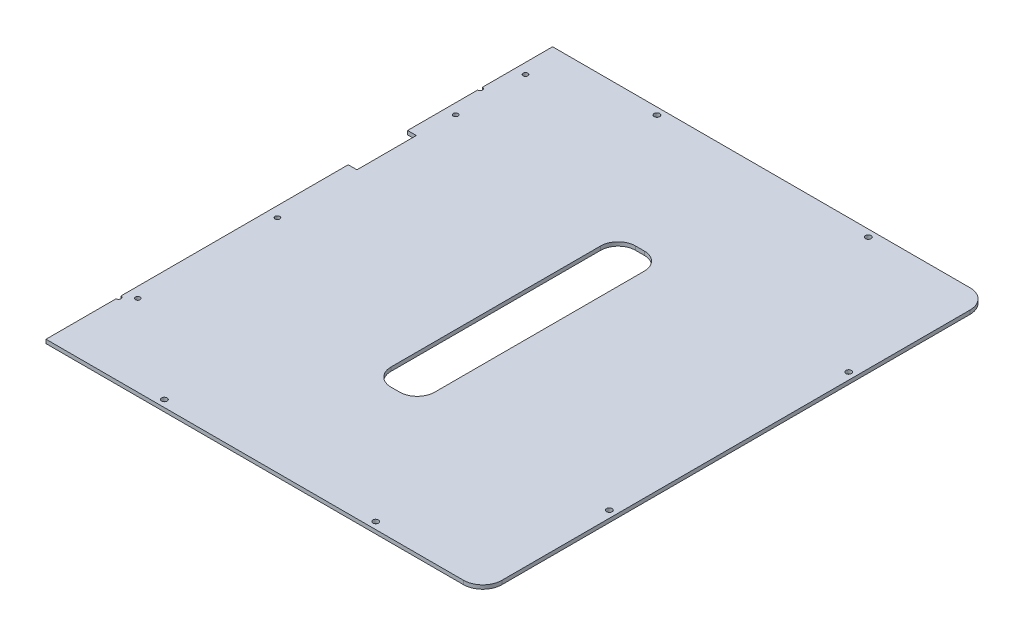
ISO-10303-21;
HEADER;
FILE_DESCRIPTION(('STEP AP214'),'2;1');
FILE_NAME('part.step','',(''),(''),'','','');
FILE_SCHEMA(('AUTOMOTIVE_DESIGN { 1 0 10303 214 1 1 1 1 }'));
ENDSEC;
DATA;
#1=APPLICATION_CONTEXT('core data for automotive mechanical design processes');
#2=APPLICATION_PROTOCOL_DEFINITION('international standard','automotive_design',2000,#1);
#3=PRODUCT_CONTEXT('',#1,'mechanical');
#4=PRODUCT('Part','Part','',(#3));
#5=PRODUCT_RELATED_PRODUCT_CATEGORY('part','',(#4));
#6=PRODUCT_DEFINITION_FORMATION('','',#4);
#7=PRODUCT_DEFINITION_CONTEXT('part definition',#1,'design');
#8=PRODUCT_DEFINITION('design','',#6,#7);
#9=PRODUCT_DEFINITION_SHAPE('','',#8);
#10=(LENGTH_UNIT() NAMED_UNIT(*) SI_UNIT(.MILLI.,.METRE.));
#11=(NAMED_UNIT(*) PLANE_ANGLE_UNIT() SI_UNIT($,.RADIAN.));
#12=(NAMED_UNIT(*) SI_UNIT($,.STERADIAN.) SOLID_ANGLE_UNIT());
#13=UNCERTAINTY_MEASURE_WITH_UNIT(LENGTH_MEASURE(1.E-05),#10,'distance_accuracy_value','');
#14=(GEOMETRIC_REPRESENTATION_CONTEXT(3) GLOBAL_UNCERTAINTY_ASSIGNED_CONTEXT((#13)) GLOBAL_UNIT_ASSIGNED_CONTEXT((#10,
#11,#12)) REPRESENTATION_CONTEXT('',''));
#15=CARTESIAN_POINT('',(0.,0.,0.));
#16=DIRECTION('',(0.,0.,1.));
#17=DIRECTION('',(1.,0.,0.));
#18=AXIS2_PLACEMENT_3D('',#15,#16,#17);
#19=CARTESIAN_POINT('',(-239.,2.2,134.));
#20=DIRECTION('',(0.,1.,0.));
#21=DIRECTION('',(0.,0.,1.));
#22=AXIS2_PLACEMENT_3D('',#19,#20,#21);
#23=PLANE('',#22);
#24=DIRECTION('',(0.,0.,-1.));
#25=VECTOR('',#24,1.);
#26=CARTESIAN_POINT('',(1.66533453693773E-13,2.2,-145.));
#27=LINE('',#26,#25);
#28=CARTESIAN_POINT('',(1.66533453693773E-13,2.2,145.));
#29=VERTEX_POINT('',#28);
#30=CARTESIAN_POINT('',(1.66533453693774E-13,2.2,104.9));
#31=VERTEX_POINT('',#30);
#32=EDGE_CURVE('E56',#29,#31,#27,.T.);
#33=ORIENTED_EDGE('',*,*,#32,.F.);
#34=DIRECTION('',(1.,0.,0.));
#35=VECTOR('',#34,1.);
#36=CARTESIAN_POINT('',(-239.,2.2,145.));
#37=LINE('',#36,#35);
#38=CARTESIAN_POINT('',(239.,2.2,145.));
#39=VERTEX_POINT('',#38);
#40=EDGE_CURVE('E239',#29,#39,#37,.T.);
#41=ORIENTED_EDGE('',*,*,#40,.T.);
#42=CARTESIAN_POINT('',(239.,2.2,134.));
#43=DIRECTION('',(0.,1.,0.));
#44=DIRECTION('',(0.,0.,-1.));
#45=AXIS2_PLACEMENT_3D('',#42,#43,#44);
#46=CIRCLE('',#45,11.);
#47=CARTESIAN_POINT('',(250.,2.2,134.));
#48=VERTEX_POINT('',#47);
#49=EDGE_CURVE('E441',#39,#48,#46,.T.);
#50=ORIENTED_EDGE('',*,*,#49,.T.);
#51=DIRECTION('',(0.,0.,-1.));
#52=VECTOR('',#51,1.);
#53=CARTESIAN_POINT('',(250.,2.2,-134.));
#54=LINE('',#53,#52);
#55=CARTESIAN_POINT('',(250.,2.2,-134.));
#56=VERTEX_POINT('',#55);
#57=EDGE_CURVE('E221',#48,#56,#54,.T.);
#58=ORIENTED_EDGE('',*,*,#57,.T.);
#59=CARTESIAN_POINT('',(239.,2.2,-134.));
#60=DIRECTION('',(0.,1.,0.));
#61=DIRECTION('',(0.,0.,1.));
#62=AXIS2_PLACEMENT_3D('',#59,#60,#61);
#63=CIRCLE('',#62,11.);
#64=CARTESIAN_POINT('',(239.,2.2,-145.));
#65=VERTEX_POINT('',#64);
#66=EDGE_CURVE('E212',#56,#65,#63,.T.);
#67=ORIENTED_EDGE('',*,*,#66,.T.);
#68=DIRECTION('',(-1.,0.,0.));
#69=VECTOR('',#68,1.);
#70=CARTESIAN_POINT('',(-239.,2.2,-145.));
#71=LINE('',#70,#69);
#72=CARTESIAN_POINT('',(1.66533453693773E-13,2.2,-145.));
#73=VERTEX_POINT('',#72);
#74=EDGE_CURVE('E204',#65,#73,#71,.T.);
#75=ORIENTED_EDGE('',*,*,#74,.T.);
#76=CARTESIAN_POINT('',(1.66533453693773E-13,2.2,-104.9));
#77=VERTEX_POINT('',#76);
#78=EDGE_CURVE('E187',#77,#73,#27,.T.);
#79=ORIENTED_EDGE('',*,*,#78,.F.);
#80=CARTESIAN_POINT('',(0.,2.2,-103.5));
#81=DIRECTION('',(0.,1.,0.));
#82=DIRECTION('',(0.,0.,1.));
#83=AXIS2_PLACEMENT_3D('',#80,#81,#82);
#84=CIRCLE('',#83,1.40000000000001);
#85=CARTESIAN_POINT('',(1.66533453693773E-13,2.2,-102.1));
#86=VERTEX_POINT('',#85);
#87=EDGE_CURVE('E402',#86,#77,#84,.T.);
#88=ORIENTED_EDGE('',*,*,#87,.F.);
#89=CARTESIAN_POINT('',(1.66533453693773E-13,2.2,-62.0000000000001));
#90=VERTEX_POINT('',#89);
#91=EDGE_CURVE('E197',#90,#86,#27,.T.);
#92=ORIENTED_EDGE('',*,*,#91,.F.);
#93=DIRECTION('',(-1.,0.,0.));
#94=VECTOR('',#93,1.);
#95=CARTESIAN_POINT('',(-5.,2.2,-62.0000000000001));
#96=LINE('',#95,#94);
#97=CARTESIAN_POINT('',(5.,2.2,-62.0000000000001));
#98=VERTEX_POINT('',#97);
#99=EDGE_CURVE('E781',#98,#90,#96,.T.);
#100=ORIENTED_EDGE('',*,*,#99,.F.);
#101=DIRECTION('',(0.,0.,-1.));
#102=VECTOR('',#101,1.);
#103=CARTESIAN_POINT('',(5.,2.2,-28.));
#104=LINE('',#103,#102);
#105=CARTESIAN_POINT('',(5.,2.2,-28.));
#106=VERTEX_POINT('',#105);
#107=EDGE_CURVE('E285',#106,#98,#104,.T.);
#108=ORIENTED_EDGE('',*,*,#107,.F.);
#109=DIRECTION('',(1.,0.,0.));
#110=VECTOR('',#109,1.);
#111=CARTESIAN_POINT('',(-5.,2.2,-28.));
#112=LINE('',#111,#110);
#113=CARTESIAN_POINT('',(1.66533453693773E-13,2.2,-28.));
#114=VERTEX_POINT('',#113);
#115=EDGE_CURVE('E280',#114,#106,#112,.T.);
#116=ORIENTED_EDGE('',*,*,#115,.F.);
#117=CARTESIAN_POINT('',(1.66533453693773E-13,2.2,102.1));
#118=VERTEX_POINT('',#117);
#119=EDGE_CURVE('E791',#118,#114,#27,.T.);
#120=ORIENTED_EDGE('',*,*,#119,.F.);
#121=CARTESIAN_POINT('',(0.,2.2,103.5));
#122=DIRECTION('',(0.,1.,0.));
#123=DIRECTION('',(0.,0.,1.));
#124=AXIS2_PLACEMENT_3D('',#121,#122,#123);
#125=CIRCLE('',#124,1.4);
#126=EDGE_CURVE('E409',#31,#118,#125,.T.);
#127=ORIENTED_EDGE('',*,*,#126,.F.);
#128=EDGE_LOOP('',(#33,#41,#50,#58,#67,#75,#79,#88,#92,#100,#108,#116,#120,#127));
#129=FACE_BOUND('',#128,.T.);
#130=CARTESIAN_POINT('',(6.00000000000004,2.2,98.5));
#131=DIRECTION('',(0.,1.,0.));
#132=DIRECTION('',(0.,0.,1.));
#133=AXIS2_PLACEMENT_3D('',#130,#131,#132);
#134=CIRCLE('',#133,1.35);
#135=CARTESIAN_POINT('',(6.00000000000004,2.2,99.85));
#136=VERTEX_POINT('',#135);
#137=EDGE_CURVE('E773',#136,#136,#134,.T.);
#138=ORIENTED_EDGE('',*,*,#137,.F.);
#139=EDGE_LOOP('',(#138));
#140=FACE_BOUND('',#139,.T.);
#141=CARTESIAN_POINT('',(6.00000000000004,2.2,18.5));
#142=DIRECTION('',(0.,1.,0.));
#143=DIRECTION('',(0.,0.,1.));
#144=AXIS2_PLACEMENT_3D('',#141,#142,#143);
#145=CIRCLE('',#144,1.35);
#146=CARTESIAN_POINT('',(6.00000000000004,2.2,19.85));
#147=VERTEX_POINT('',#146);
#148=EDGE_CURVE('E256',#147,#147,#145,.T.);
#149=ORIENTED_EDGE('',*,*,#148,.F.);
#150=EDGE_LOOP('',(#149));
#151=FACE_BOUND('',#150,.T.);
#152=CARTESIAN_POINT('',(5.99999999999996,2.2,-83.5000000000001));
#153=DIRECTION('',(0.,1.,0.));
#154=DIRECTION('',(0.,0.,1.));
#155=AXIS2_PLACEMENT_3D('',#152,#153,#154);
#156=CIRCLE('',#155,1.35);
#157=CARTESIAN_POINT('',(5.99999999999996,2.2,-82.1500000000001));
#158=VERTEX_POINT('',#157);
#159=EDGE_CURVE('E765',#158,#158,#156,.T.);
#160=ORIENTED_EDGE('',*,*,#159,.F.);
#161=EDGE_LOOP('',(#160));
#162=FACE_BOUND('',#161,.T.);
#163=CARTESIAN_POINT('',(5.99999999999996,2.2,-123.5));
#164=DIRECTION('',(0.,1.,0.));
#165=DIRECTION('',(0.,0.,1.));
#166=AXIS2_PLACEMENT_3D('',#163,#164,#165);
#167=CIRCLE('',#166,1.35);
#168=CARTESIAN_POINT('',(5.99999999999996,2.2,-122.15));
#169=VERTEX_POINT('',#168);
#170=EDGE_CURVE('E769',#169,#169,#167,.T.);
#171=ORIENTED_EDGE('',*,*,#170,.F.);
#172=EDGE_LOOP('',(#171));
#173=FACE_BOUND('',#172,.T.);
#174=CARTESIAN_POINT('',(63.75,2.2,141.));
#175=DIRECTION('',(0.,1.,0.));
#176=DIRECTION('',(0.,0.,-1.));
#177=AXIS2_PLACEMENT_3D('',#174,#175,#176);
#178=CIRCLE('',#177,1.6);
#179=CARTESIAN_POINT('',(63.75,2.2,139.4));
#180=VERTEX_POINT('',#179);
#181=EDGE_CURVE('E295',#180,#180,#178,.T.);
#182=ORIENTED_EDGE('',*,*,#181,.F.);
#183=EDGE_LOOP('',(#182));
#184=FACE_BOUND('',#183,.T.);
#185=CARTESIAN_POINT('',(184.75,2.2,141.));
#186=DIRECTION('',(0.,1.,0.));
#187=DIRECTION('',(0.,0.,-1.));
#188=AXIS2_PLACEMENT_3D('',#185,#186,#187);
#189=CIRCLE('',#188,1.59999999999999);
#190=CARTESIAN_POINT('',(184.75,2.2,139.4));
#191=VERTEX_POINT('',#190);
#192=EDGE_CURVE('E311',#191,#191,#189,.T.);
#193=ORIENTED_EDGE('',*,*,#192,.F.);
#194=EDGE_LOOP('',(#193));
#195=FACE_BOUND('',#194,.T.);
#196=DIRECTION('',(-1.,0.,0.));
#197=VECTOR('',#196,1.);
#198=CARTESIAN_POINT('',(122.5,2.2,-70.0000000000001));
#199=LINE('',#198,#197);
#200=CARTESIAN_POINT('',(127.5,2.2,-70.0000000000001));
#201=VERTEX_POINT('',#200);
#202=CARTESIAN_POINT('',(122.5,2.2,-70.));
#203=VERTEX_POINT('',#202);
#204=EDGE_CURVE('E322',#201,#203,#199,.T.);
#205=ORIENTED_EDGE('',*,*,#204,.F.);
#206=CARTESIAN_POINT('',(127.5,2.2,-60.0000000000001));
#207=DIRECTION('',(0.,1.,0.));
#208=DIRECTION('',(0.,0.,1.));
#209=AXIS2_PLACEMENT_3D('',#206,#207,#208);
#210=CIRCLE('',#209,10.);
#211=CARTESIAN_POINT('',(137.5,2.2,-60.0000000000001));
#212=VERTEX_POINT('',#211);
#213=EDGE_CURVE('E319',#212,#201,#210,.T.);
#214=ORIENTED_EDGE('',*,*,#213,.F.);
#215=DIRECTION('',(0.,0.,-1.));
#216=VECTOR('',#215,1.);
#217=CARTESIAN_POINT('',(137.5,2.2,60.));
#218=LINE('',#217,#216);
#219=CARTESIAN_POINT('',(137.5,2.2,60.));
#220=VERTEX_POINT('',#219);
#221=EDGE_CURVE('E342',#220,#212,#218,.T.);
#222=ORIENTED_EDGE('',*,*,#221,.F.);
#223=CARTESIAN_POINT('',(127.5,2.2,60.));
#224=DIRECTION('',(0.,1.,0.));
#225=DIRECTION('',(0.,0.,-1.));
#226=AXIS2_PLACEMENT_3D('',#223,#224,#225);
#227=CIRCLE('',#226,10.);
#228=CARTESIAN_POINT('',(127.5,2.2,70.));
#229=VERTEX_POINT('',#228);
#230=EDGE_CURVE('E338',#229,#220,#227,.T.);
#231=ORIENTED_EDGE('',*,*,#230,.F.);
#232=DIRECTION('',(1.,0.,0.));
#233=VECTOR('',#232,1.);
#234=CARTESIAN_POINT('',(122.5,2.2,70.));
#235=LINE('',#234,#233);
#236=CARTESIAN_POINT('',(122.5,2.2,70.));
#237=VERTEX_POINT('',#236);
#238=EDGE_CURVE('E335',#237,#229,#235,.T.);
#239=ORIENTED_EDGE('',*,*,#238,.F.);
#240=CARTESIAN_POINT('',(122.5,2.2,60.));
#241=DIRECTION('',(0.,1.,0.));
#242=DIRECTION('',(0.,0.,1.));
#243=AXIS2_PLACEMENT_3D('',#240,#241,#242);
#244=CIRCLE('',#243,9.99999999999999);
#245=CARTESIAN_POINT('',(112.5,2.2,60.));
#246=VERTEX_POINT('',#245);
#247=EDGE_CURVE('E332',#246,#237,#244,.T.);
#248=ORIENTED_EDGE('',*,*,#247,.F.);
#249=DIRECTION('',(0.,0.,1.));
#250=VECTOR('',#249,1.);
#251=CARTESIAN_POINT('',(112.5,2.2,60.));
#252=LINE('',#251,#250);
#253=CARTESIAN_POINT('',(112.5,2.2,-60.0000000000001));
#254=VERTEX_POINT('',#253);
#255=EDGE_CURVE('E329',#254,#246,#252,.T.);
#256=ORIENTED_EDGE('',*,*,#255,.F.);
#257=CARTESIAN_POINT('',(122.5,2.2,-60.0000000000001));
#258=DIRECTION('',(0.,1.,0.));
#259=DIRECTION('',(0.,0.,1.));
#260=AXIS2_PLACEMENT_3D('',#257,#258,#259);
#261=CIRCLE('',#260,9.99999999999999);
#262=EDGE_CURVE('E326',#203,#254,#261,.T.);
#263=ORIENTED_EDGE('',*,*,#262,.F.);
#264=EDGE_LOOP('',(#205,#214,#222,#231,#239,#248,#256,#263));
#265=FACE_BOUND('',#264,.T.);
#266=CARTESIAN_POINT('',(246.,2.2,-68.5));
#267=DIRECTION('',(0.,1.,0.));
#268=DIRECTION('',(0.,0.,1.));
#269=AXIS2_PLACEMENT_3D('',#266,#267,#268);
#270=CIRCLE('',#269,1.60000000000002);
#271=CARTESIAN_POINT('',(246.,2.2,-66.9));
#272=VERTEX_POINT('',#271);
#273=EDGE_CURVE('E417',#272,#272,#270,.T.);
#274=ORIENTED_EDGE('',*,*,#273,.F.);
#275=EDGE_LOOP('',(#274));
#276=FACE_BOUND('',#275,.T.);
#277=CARTESIAN_POINT('',(63.75,2.2,-141.));
#278=DIRECTION('',(0.,1.,0.));
#279=DIRECTION('',(0.,0.,1.));
#280=AXIS2_PLACEMENT_3D('',#277,#278,#279);
#281=CIRCLE('',#280,1.6);
#282=CARTESIAN_POINT('',(63.75,2.2,-139.4));
#283=VERTEX_POINT('',#282);
#284=EDGE_CURVE('E229',#283,#283,#281,.T.);
#285=ORIENTED_EDGE('',*,*,#284,.F.);
#286=EDGE_LOOP('',(#285));
#287=FACE_BOUND('',#286,.T.);
#288=CARTESIAN_POINT('',(184.75,2.2,-141.));
#289=DIRECTION('',(0.,1.,0.));
#290=DIRECTION('',(0.,0.,1.));
#291=AXIS2_PLACEMENT_3D('',#288,#289,#290);
#292=CIRCLE('',#291,1.59999999999999);
#293=CARTESIAN_POINT('',(184.75,2.2,-139.4));
#294=VERTEX_POINT('',#293);
#295=EDGE_CURVE('E425',#294,#294,#292,.T.);
#296=ORIENTED_EDGE('',*,*,#295,.F.);
#297=EDGE_LOOP('',(#296));
#298=FACE_BOUND('',#297,.T.);
#299=CARTESIAN_POINT('',(246.,2.2,68.4999999999999));
#300=DIRECTION('',(0.,1.,0.));
#301=DIRECTION('',(0.,0.,-1.));
#302=AXIS2_PLACEMENT_3D('',#299,#300,#301);
#303=CIRCLE('',#302,1.60000000000002);
#304=CARTESIAN_POINT('',(246.,2.2,66.8999999999999));
#305=VERTEX_POINT('',#304);
#306=EDGE_CURVE('E303',#305,#305,#303,.T.);
#307=ORIENTED_EDGE('',*,*,#306,.F.);
#308=EDGE_LOOP('',(#307));
#309=FACE_BOUND('',#308,.T.);
#310=ADVANCED_FACE('F40',(#129,#140,#151,#162,#173,#184,#195,#265,#276,#287,#298,#309),#23,.T.);
#311=CARTESIAN_POINT('',(-239.,0.,134.));
#312=DIRECTION('',(0.,1.,0.));
#313=DIRECTION('',(0.,0.,1.));
#314=AXIS2_PLACEMENT_3D('',#311,#312,#313);
#315=PLANE('',#314);
#316=CARTESIAN_POINT('',(6.00000000000004,0.,98.5));
#317=DIRECTION('',(0.,1.,0.));
#318=DIRECTION('',(0.,0.,1.));
#319=AXIS2_PLACEMENT_3D('',#316,#317,#318);
#320=CIRCLE('',#319,1.35);
#321=CARTESIAN_POINT('',(6.00000000000004,0.,99.85));
#322=VERTEX_POINT('',#321);
#323=EDGE_CURVE('E263',#322,#322,#320,.T.);
#324=ORIENTED_EDGE('',*,*,#323,.T.);
#325=EDGE_LOOP('',(#324));
#326=FACE_BOUND('',#325,.T.);
#327=CARTESIAN_POINT('',(6.00000000000004,0.,18.5));
#328=DIRECTION('',(0.,1.,0.));
#329=DIRECTION('',(0.,0.,1.));
#330=AXIS2_PLACEMENT_3D('',#327,#328,#329);
#331=CIRCLE('',#330,1.35);
#332=CARTESIAN_POINT('',(6.00000000000004,0.,19.85));
#333=VERTEX_POINT('',#332);
#334=EDGE_CURVE('E260',#333,#333,#331,.T.);
#335=ORIENTED_EDGE('',*,*,#334,.T.);
#336=EDGE_LOOP('',(#335));
#337=FACE_BOUND('',#336,.T.);
#338=CARTESIAN_POINT('',(5.99999999999996,0.,-83.5000000000001));
#339=DIRECTION('',(0.,1.,0.));
#340=DIRECTION('',(0.,0.,1.));
#341=AXIS2_PLACEMENT_3D('',#338,#339,#340);
#342=CIRCLE('',#341,1.35);
#343=CARTESIAN_POINT('',(5.99999999999996,0.,-82.1500000000001));
#344=VERTEX_POINT('',#343);
#345=EDGE_CURVE('E255',#344,#344,#342,.T.);
#346=ORIENTED_EDGE('',*,*,#345,.T.);
#347=EDGE_LOOP('',(#346));
#348=FACE_BOUND('',#347,.T.);
#349=CARTESIAN_POINT('',(5.99999999999996,0.,-123.5));
#350=DIRECTION('',(0.,1.,0.));
#351=DIRECTION('',(0.,0.,1.));
#352=AXIS2_PLACEMENT_3D('',#349,#350,#351);
#353=CIRCLE('',#352,1.35);
#354=CARTESIAN_POINT('',(5.99999999999996,0.,-122.15));
#355=VERTEX_POINT('',#354);
#356=EDGE_CURVE('E251',#355,#355,#353,.T.);
#357=ORIENTED_EDGE('',*,*,#356,.T.);
#358=EDGE_LOOP('',(#357));
#359=FACE_BOUND('',#358,.T.);
#360=CARTESIAN_POINT('',(63.75,0.,141.));
#361=DIRECTION('',(0.,1.,0.));
#362=DIRECTION('',(0.,0.,-1.));
#363=AXIS2_PLACEMENT_3D('',#360,#361,#362);
#364=CIRCLE('',#363,1.6);
#365=CARTESIAN_POINT('',(63.75,0.,139.4));
#366=VERTEX_POINT('',#365);
#367=EDGE_CURVE('E294',#366,#366,#364,.T.);
#368=ORIENTED_EDGE('',*,*,#367,.T.);
#369=EDGE_LOOP('',(#368));
#370=FACE_BOUND('',#369,.T.);
#371=CARTESIAN_POINT('',(246.,0.,68.4999999999999));
#372=DIRECTION('',(0.,1.,0.));
#373=DIRECTION('',(0.,0.,-1.));
#374=AXIS2_PLACEMENT_3D('',#371,#372,#373);
#375=CIRCLE('',#374,1.60000000000002);
#376=CARTESIAN_POINT('',(246.,0.,66.8999999999999));
#377=VERTEX_POINT('',#376);
#378=EDGE_CURVE('E299',#377,#377,#375,.T.);
#379=ORIENTED_EDGE('',*,*,#378,.T.);
#380=EDGE_LOOP('',(#379));
#381=FACE_BOUND('',#380,.T.);
#382=CARTESIAN_POINT('',(184.75,0.,141.));
#383=DIRECTION('',(0.,1.,0.));
#384=DIRECTION('',(0.,0.,-1.));
#385=AXIS2_PLACEMENT_3D('',#382,#383,#384);
#386=CIRCLE('',#385,1.59999999999999);
#387=CARTESIAN_POINT('',(184.75,0.,139.4));
#388=VERTEX_POINT('',#387);
#389=EDGE_CURVE('E307',#388,#388,#386,.T.);
#390=ORIENTED_EDGE('',*,*,#389,.T.);
#391=EDGE_LOOP('',(#390));
#392=FACE_BOUND('',#391,.T.);
#393=DIRECTION('',(1.,0.,0.));
#394=VECTOR('',#393,1.);
#395=CARTESIAN_POINT('',(-239.,0.,145.));
#396=LINE('',#395,#394);
#397=CARTESIAN_POINT('',(1.66533453693773E-13,0.,145.));
#398=VERTEX_POINT('',#397);
#399=CARTESIAN_POINT('',(239.,0.,145.));
#400=VERTEX_POINT('',#399);
#401=EDGE_CURVE('E225',#398,#400,#396,.T.);
#402=ORIENTED_EDGE('',*,*,#401,.F.);
#403=DIRECTION('',(0.,0.,1.));
#404=VECTOR('',#403,1.);
#405=CARTESIAN_POINT('',(1.66533453693773E-13,0.,-145.));
#406=LINE('',#405,#404);
#407=CARTESIAN_POINT('',(1.66533453693773E-13,0.,104.9));
#408=VERTEX_POINT('',#407);
#409=EDGE_CURVE('E208',#408,#398,#406,.T.);
#410=ORIENTED_EDGE('',*,*,#409,.F.);
#411=CARTESIAN_POINT('',(0.,0.,103.5));
#412=DIRECTION('',(0.,1.,0.));
#413=DIRECTION('',(0.,0.,1.));
#414=AXIS2_PLACEMENT_3D('',#411,#412,#413);
#415=CIRCLE('',#414,1.4);
#416=CARTESIAN_POINT('',(1.66533453693773E-13,0.,102.1));
#417=VERTEX_POINT('',#416);
#418=EDGE_CURVE('E405',#408,#417,#415,.T.);
#419=ORIENTED_EDGE('',*,*,#418,.T.);
#420=CARTESIAN_POINT('',(1.66533453693773E-13,0.,-28.));
#421=VERTEX_POINT('',#420);
#422=EDGE_CURVE('E466',#421,#417,#406,.T.);
#423=ORIENTED_EDGE('',*,*,#422,.F.);
#424=DIRECTION('',(1.,0.,0.));
#425=VECTOR('',#424,1.);
#426=CARTESIAN_POINT('',(-5.,0.,-28.));
#427=LINE('',#426,#425);
#428=CARTESIAN_POINT('',(5.,0.,-28.));
#429=VERTEX_POINT('',#428);
#430=EDGE_CURVE('E277',#421,#429,#427,.T.);
#431=ORIENTED_EDGE('',*,*,#430,.T.);
#432=DIRECTION('',(0.,0.,-1.));
#433=VECTOR('',#432,1.);
#434=CARTESIAN_POINT('',(5.,0.,-28.));
#435=LINE('',#434,#433);
#436=CARTESIAN_POINT('',(5.,0.,-62.0000000000001));
#437=VERTEX_POINT('',#436);
#438=EDGE_CURVE('E266',#429,#437,#435,.T.);
#439=ORIENTED_EDGE('',*,*,#438,.T.);
#440=DIRECTION('',(-1.,0.,0.));
#441=VECTOR('',#440,1.);
#442=CARTESIAN_POINT('',(-5.,0.,-62.0000000000001));
#443=LINE('',#442,#441);
#444=CARTESIAN_POINT('',(1.66533453693773E-13,0.,-62.0000000000001));
#445=VERTEX_POINT('',#444);
#446=EDGE_CURVE('E271',#437,#445,#443,.T.);
#447=ORIENTED_EDGE('',*,*,#446,.T.);
#448=CARTESIAN_POINT('',(1.66533453693773E-13,0.,-102.1));
#449=VERTEX_POINT('',#448);
#450=EDGE_CURVE('E461',#449,#445,#406,.T.);
#451=ORIENTED_EDGE('',*,*,#450,.F.);
#452=CARTESIAN_POINT('',(0.,0.,-103.5));
#453=DIRECTION('',(0.,1.,0.));
#454=DIRECTION('',(0.,0.,1.));
#455=AXIS2_PLACEMENT_3D('',#452,#453,#454);
#456=CIRCLE('',#455,1.40000000000001);
#457=CARTESIAN_POINT('',(1.66533453693773E-13,0.,-104.9));
#458=VERTEX_POINT('',#457);
#459=EDGE_CURVE('E401',#449,#458,#456,.T.);
#460=ORIENTED_EDGE('',*,*,#459,.T.);
#461=CARTESIAN_POINT('',(1.66533453693773E-13,0.,-145.));
#462=VERTEX_POINT('',#461);
#463=EDGE_CURVE('E64',#462,#458,#406,.T.);
#464=ORIENTED_EDGE('',*,*,#463,.F.);
#465=DIRECTION('',(-1.,0.,0.));
#466=VECTOR('',#465,1.);
#467=CARTESIAN_POINT('',(-239.,0.,-145.));
#468=LINE('',#467,#466);
#469=CARTESIAN_POINT('',(239.,0.,-145.));
#470=VERTEX_POINT('',#469);
#471=EDGE_CURVE('E206',#470,#462,#468,.T.);
#472=ORIENTED_EDGE('',*,*,#471,.F.);
#473=CARTESIAN_POINT('',(239.,0.,-134.));
#474=DIRECTION('',(0.,1.,0.));
#475=DIRECTION('',(0.,0.,1.));
#476=AXIS2_PLACEMENT_3D('',#473,#474,#475);
#477=CIRCLE('',#476,11.);
#478=CARTESIAN_POINT('',(250.,0.,-134.));
#479=VERTEX_POINT('',#478);
#480=EDGE_CURVE('E235',#479,#470,#477,.T.);
#481=ORIENTED_EDGE('',*,*,#480,.F.);
#482=DIRECTION('',(0.,0.,-1.));
#483=VECTOR('',#482,1.);
#484=CARTESIAN_POINT('',(250.,0.,-134.));
#485=LINE('',#484,#483);
#486=CARTESIAN_POINT('',(250.,0.,134.));
#487=VERTEX_POINT('',#486);
#488=EDGE_CURVE('E232',#487,#479,#485,.T.);
#489=ORIENTED_EDGE('',*,*,#488,.F.);
#490=CARTESIAN_POINT('',(239.,0.,134.));
#491=DIRECTION('',(0.,1.,0.));
#492=DIRECTION('',(0.,0.,-1.));
#493=AXIS2_PLACEMENT_3D('',#490,#491,#492);
#494=CIRCLE('',#493,11.);
#495=EDGE_CURVE('E228',#400,#487,#494,.T.);
#496=ORIENTED_EDGE('',*,*,#495,.F.);
#497=EDGE_LOOP('',(#402,#410,#419,#423,#431,#439,#447,#451,#460,#464,#472,#481,#489,#496));
#498=FACE_BOUND('',#497,.T.);
#499=CARTESIAN_POINT('',(246.,0.,-68.5));
#500=DIRECTION('',(0.,1.,0.));
#501=DIRECTION('',(0.,0.,1.));
#502=AXIS2_PLACEMENT_3D('',#499,#500,#501);
#503=CIRCLE('',#502,1.60000000000002);
#504=CARTESIAN_POINT('',(246.,0.,-66.9));
#505=VERTEX_POINT('',#504);
#506=EDGE_CURVE('E413',#505,#505,#503,.T.);
#507=ORIENTED_EDGE('',*,*,#506,.T.);
#508=EDGE_LOOP('',(#507));
#509=FACE_BOUND('',#508,.T.);
#510=CARTESIAN_POINT('',(184.75,0.,-141.));
#511=DIRECTION('',(0.,1.,0.));
#512=DIRECTION('',(0.,0.,1.));
#513=AXIS2_PLACEMENT_3D('',#510,#511,#512);
#514=CIRCLE('',#513,1.59999999999999);
#515=CARTESIAN_POINT('',(184.75,0.,-139.4));
#516=VERTEX_POINT('',#515);
#517=EDGE_CURVE('E421',#516,#516,#514,.T.);
#518=ORIENTED_EDGE('',*,*,#517,.T.);
#519=EDGE_LOOP('',(#518));
#520=FACE_BOUND('',#519,.T.);
#521=CARTESIAN_POINT('',(63.75,0.,-141.));
#522=DIRECTION('',(0.,1.,0.));
#523=DIRECTION('',(0.,0.,1.));
#524=AXIS2_PLACEMENT_3D('',#521,#522,#523);
#525=CIRCLE('',#524,1.6);
#526=CARTESIAN_POINT('',(63.75,0.,-139.4));
#527=VERTEX_POINT('',#526);
#528=EDGE_CURVE('E429',#527,#527,#525,.T.);
#529=ORIENTED_EDGE('',*,*,#528,.T.);
#530=EDGE_LOOP('',(#529));
#531=FACE_BOUND('',#530,.T.);
#532=CARTESIAN_POINT('',(127.5,0.,-60.0000000000001));
#533=DIRECTION('',(0.,1.,0.));
#534=DIRECTION('',(0.,0.,1.));
#535=AXIS2_PLACEMENT_3D('',#532,#533,#534);
#536=CIRCLE('',#535,10.);
#537=CARTESIAN_POINT('',(137.5,0.,-60.0000000000001));
#538=VERTEX_POINT('',#537);
#539=CARTESIAN_POINT('',(127.5,0.,-70.0000000000001));
#540=VERTEX_POINT('',#539);
#541=EDGE_CURVE('E315',#538,#540,#536,.T.);
#542=ORIENTED_EDGE('',*,*,#541,.T.);
#543=DIRECTION('',(-1.,0.,0.));
#544=VECTOR('',#543,1.);
#545=CARTESIAN_POINT('',(122.5,0.,-70.0000000000001));
#546=LINE('',#545,#544);
#547=CARTESIAN_POINT('',(122.5,0.,-70.));
#548=VERTEX_POINT('',#547);
#549=EDGE_CURVE('E349',#540,#548,#546,.T.);
#550=ORIENTED_EDGE('',*,*,#549,.T.);
#551=CARTESIAN_POINT('',(122.5,0.,-60.0000000000001));
#552=DIRECTION('',(0.,1.,0.));
#553=DIRECTION('',(0.,0.,1.));
#554=AXIS2_PLACEMENT_3D('',#551,#552,#553);
#555=CIRCLE('',#554,9.99999999999999);
#556=CARTESIAN_POINT('',(112.5,0.,-60.0000000000001));
#557=VERTEX_POINT('',#556);
#558=EDGE_CURVE('E353',#548,#557,#555,.T.);
#559=ORIENTED_EDGE('',*,*,#558,.T.);
#560=DIRECTION('',(0.,0.,1.));
#561=VECTOR('',#560,1.);
#562=CARTESIAN_POINT('',(112.5,0.,60.));
#563=LINE('',#562,#561);
#564=CARTESIAN_POINT('',(112.5,0.,60.));
#565=VERTEX_POINT('',#564);
#566=EDGE_CURVE('E357',#557,#565,#563,.T.);
#567=ORIENTED_EDGE('',*,*,#566,.T.);
#568=CARTESIAN_POINT('',(122.5,0.,60.));
#569=DIRECTION('',(0.,1.,0.));
#570=DIRECTION('',(0.,0.,1.));
#571=AXIS2_PLACEMENT_3D('',#568,#569,#570);
#572=CIRCLE('',#571,9.99999999999999);
#573=CARTESIAN_POINT('',(122.5,0.,70.));
#574=VERTEX_POINT('',#573);
#575=EDGE_CURVE('E361',#565,#574,#572,.T.);
#576=ORIENTED_EDGE('',*,*,#575,.T.);
#577=DIRECTION('',(1.,0.,0.));
#578=VECTOR('',#577,1.);
#579=CARTESIAN_POINT('',(122.5,0.,70.));
#580=LINE('',#579,#578);
#581=CARTESIAN_POINT('',(127.5,0.,70.));
#582=VERTEX_POINT('',#581);
#583=EDGE_CURVE('E365',#574,#582,#580,.T.);
#584=ORIENTED_EDGE('',*,*,#583,.T.);
#585=CARTESIAN_POINT('',(127.5,0.,60.));
#586=DIRECTION('',(0.,1.,0.));
#587=DIRECTION('',(0.,0.,-1.));
#588=AXIS2_PLACEMENT_3D('',#585,#586,#587);
#589=CIRCLE('',#588,10.);
#590=CARTESIAN_POINT('',(137.5,0.,60.));
#591=VERTEX_POINT('',#590);
#592=EDGE_CURVE('E369',#582,#591,#589,.T.);
#593=ORIENTED_EDGE('',*,*,#592,.T.);
#594=DIRECTION('',(0.,0.,-1.));
#595=VECTOR('',#594,1.);
#596=CARTESIAN_POINT('',(137.5,0.,60.));
#597=LINE('',#596,#595);
#598=EDGE_CURVE('E323',#591,#538,#597,.T.);
#599=ORIENTED_EDGE('',*,*,#598,.T.);
#600=EDGE_LOOP('',(#542,#550,#559,#567,#576,#584,#593,#599));
#601=FACE_BOUND('',#600,.T.);
#602=ADVANCED_FACE('F455',(#326,#337,#348,#359,#370,#381,#392,#498,#509,#520,#531,#601),#315,.F.);
#603=CARTESIAN_POINT('',(-239.,2.2,145.));
#604=DIRECTION('',(0.,0.,-1.));
#605=DIRECTION('',(-1.,0.,0.));
#606=AXIS2_PLACEMENT_3D('',#603,#604,#605);
#607=PLANE('',#606);
#608=ORIENTED_EDGE('',*,*,#40,.F.);
#609=DIRECTION('',(0.,-1.,0.));
#610=VECTOR('',#609,1.);
#611=CARTESIAN_POINT('',(1.66533453693773E-13,2.2,145.));
#612=LINE('',#611,#610);
#613=EDGE_CURVE('E491',#29,#398,#612,.T.);
#614=ORIENTED_EDGE('',*,*,#613,.T.);
#615=ORIENTED_EDGE('',*,*,#401,.T.);
#616=DIRECTION('',(0.,-1.,0.));
#617=VECTOR('',#616,1.);
#618=CARTESIAN_POINT('',(239.,2.2,145.));
#619=LINE('',#618,#617);
#620=EDGE_CURVE('E49',#39,#400,#619,.T.);
#621=ORIENTED_EDGE('',*,*,#620,.F.);
#622=EDGE_LOOP('',(#608,#614,#615,#621));
#623=FACE_BOUND('',#622,.T.);
#624=ADVANCED_FACE('F42',(#623),#607,.F.);
#625=CARTESIAN_POINT('',(239.,2.2,134.));
#626=DIRECTION('',(0.,-1.,0.));
#627=DIRECTION('',(0.,0.,-1.));
#628=AXIS2_PLACEMENT_3D('',#625,#626,#627);
#629=CYLINDRICAL_SURFACE('',#628,11.);
#630=ORIENTED_EDGE('',*,*,#495,.T.);
#631=DIRECTION('',(0.,-1.,0.));
#632=VECTOR('',#631,1.);
#633=CARTESIAN_POINT('',(250.,2.2,134.));
#634=LINE('',#633,#632);
#635=EDGE_CURVE('E244',#48,#487,#634,.T.);
#636=ORIENTED_EDGE('',*,*,#635,.F.);
#637=ORIENTED_EDGE('',*,*,#49,.F.);
#638=ORIENTED_EDGE('',*,*,#620,.T.);
#639=EDGE_LOOP('',(#630,#636,#637,#638));
#640=FACE_BOUND('',#639,.T.);
#641=ADVANCED_FACE('F493',(#640),#629,.T.);
#642=CARTESIAN_POINT('',(250.,2.2,-134.));
#643=DIRECTION('',(-1.,0.,0.));
#644=DIRECTION('',(0.,0.,1.));
#645=AXIS2_PLACEMENT_3D('',#642,#643,#644);
#646=PLANE('',#645);
#647=ORIENTED_EDGE('',*,*,#488,.T.);
#648=DIRECTION('',(0.,-1.,0.));
#649=VECTOR('',#648,1.);
#650=CARTESIAN_POINT('',(250.,2.2,-134.));
#651=LINE('',#650,#649);
#652=EDGE_CURVE('E219',#56,#479,#651,.T.);
#653=ORIENTED_EDGE('',*,*,#652,.F.);
#654=ORIENTED_EDGE('',*,*,#57,.F.);
#655=ORIENTED_EDGE('',*,*,#635,.T.);
#656=EDGE_LOOP('',(#647,#653,#654,#655));
#657=FACE_BOUND('',#656,.T.);
#658=ADVANCED_FACE('F449',(#657),#646,.F.);
#659=CARTESIAN_POINT('',(239.,2.2,-134.));
#660=DIRECTION('',(0.,-1.,0.));
#661=DIRECTION('',(0.,0.,-1.));
#662=AXIS2_PLACEMENT_3D('',#659,#660,#661);
#663=CYLINDRICAL_SURFACE('',#662,11.);
#664=ORIENTED_EDGE('',*,*,#480,.T.);
#665=DIRECTION('',(0.,-1.,0.));
#666=VECTOR('',#665,1.);
#667=CARTESIAN_POINT('',(239.,2.2,-145.));
#668=LINE('',#667,#666);
#669=EDGE_CURVE('E215',#65,#470,#668,.T.);
#670=ORIENTED_EDGE('',*,*,#669,.F.);
#671=ORIENTED_EDGE('',*,*,#66,.F.);
#672=ORIENTED_EDGE('',*,*,#652,.T.);
#673=EDGE_LOOP('',(#664,#670,#671,#672));
#674=FACE_BOUND('',#673,.T.);
#675=ADVANCED_FACE('F453',(#674),#663,.T.);
#676=CARTESIAN_POINT('',(-239.,2.2,-145.));
#677=DIRECTION('',(0.,0.,1.));
#678=DIRECTION('',(1.,0.,0.));
#679=AXIS2_PLACEMENT_3D('',#676,#677,#678);
#680=PLANE('',#679);
#681=ORIENTED_EDGE('',*,*,#471,.T.);
#682=DIRECTION('',(0.,1.,0.));
#683=VECTOR('',#682,1.);
#684=CARTESIAN_POINT('',(1.66533453693773E-13,-438.135542359335,-145.));
#685=LINE('',#684,#683);
#686=EDGE_CURVE('E190',#462,#73,#685,.T.);
#687=ORIENTED_EDGE('',*,*,#686,.T.);
#688=ORIENTED_EDGE('',*,*,#74,.F.);
#689=ORIENTED_EDGE('',*,*,#669,.T.);
#690=EDGE_LOOP('',(#681,#687,#688,#689));
#691=FACE_BOUND('',#690,.T.);
#692=ADVANCED_FACE('F202',(#691),#680,.F.);
#693=CARTESIAN_POINT('',(63.75,2.2,-141.));
#694=DIRECTION('',(0.,-1.,0.));
#695=DIRECTION('',(0.,0.,-1.));
#696=AXIS2_PLACEMENT_3D('',#693,#694,#695);
#697=CYLINDRICAL_SURFACE('',#696,1.6);
#698=ORIENTED_EDGE('',*,*,#284,.T.);
#699=EDGE_LOOP('',(#698));
#700=FACE_BOUND('',#699,.T.);
#701=ORIENTED_EDGE('',*,*,#528,.F.);
#702=EDGE_LOOP('',(#701));
#703=FACE_BOUND('',#702,.T.);
#704=ADVANCED_FACE('F509',(#700,#703),#697,.F.);
#705=CARTESIAN_POINT('',(184.75,2.2,-141.));
#706=DIRECTION('',(0.,-1.,0.));
#707=DIRECTION('',(0.,0.,-1.));
#708=AXIS2_PLACEMENT_3D('',#705,#706,#707);
#709=CYLINDRICAL_SURFACE('',#708,1.59999999999999);
#710=ORIENTED_EDGE('',*,*,#295,.T.);
#711=EDGE_LOOP('',(#710));
#712=FACE_BOUND('',#711,.T.);
#713=ORIENTED_EDGE('',*,*,#517,.F.);
#714=EDGE_LOOP('',(#713));
#715=FACE_BOUND('',#714,.T.);
#716=ADVANCED_FACE('F533',(#712,#715),#709,.F.);
#717=CARTESIAN_POINT('',(246.,2.2,-68.5));
#718=DIRECTION('',(0.,-1.,0.));
#719=DIRECTION('',(0.,0.,-1.));
#720=AXIS2_PLACEMENT_3D('',#717,#718,#719);
#721=CYLINDRICAL_SURFACE('',#720,1.60000000000002);
#722=ORIENTED_EDGE('',*,*,#273,.T.);
#723=EDGE_LOOP('',(#722));
#724=FACE_BOUND('',#723,.T.);
#725=ORIENTED_EDGE('',*,*,#506,.F.);
#726=EDGE_LOOP('',(#725));
#727=FACE_BOUND('',#726,.T.);
#728=ADVANCED_FACE('F539',(#724,#727),#721,.F.);
#729=CARTESIAN_POINT('',(0.,2.2,103.5));
#730=DIRECTION('',(0.,-1.,0.));
#731=DIRECTION('',(0.,0.,-1.));
#732=AXIS2_PLACEMENT_3D('',#729,#730,#731);
#733=CYLINDRICAL_SURFACE('',#732,1.4);
#734=DIRECTION('',(0.,-1.,0.));
#735=VECTOR('',#734,1.);
#736=CARTESIAN_POINT('',(1.66533453693773E-13,2.2,104.9));
#737=LINE('',#736,#735);
#738=EDGE_CURVE('E484',#31,#408,#737,.T.);
#739=ORIENTED_EDGE('',*,*,#738,.F.);
#740=ORIENTED_EDGE('',*,*,#126,.T.);
#741=DIRECTION('',(0.,-1.,0.));
#742=VECTOR('',#741,1.);
#743=CARTESIAN_POINT('',(1.66533453693773E-13,2.2,102.1));
#744=LINE('',#743,#742);
#745=EDGE_CURVE('E475',#417,#118,#744,.F.);
#746=ORIENTED_EDGE('',*,*,#745,.F.);
#747=ORIENTED_EDGE('',*,*,#418,.F.);
#748=EDGE_LOOP('',(#739,#740,#746,#747));
#749=FACE_BOUND('',#748,.T.);
#750=ADVANCED_FACE('F481',(#749),#733,.F.);
#751=CARTESIAN_POINT('',(0.,2.2,-103.5));
#752=DIRECTION('',(0.,-1.,0.));
#753=DIRECTION('',(0.,0.,-1.));
#754=AXIS2_PLACEMENT_3D('',#751,#752,#753);
#755=CYLINDRICAL_SURFACE('',#754,1.40000000000001);
#756=DIRECTION('',(0.,-1.,0.));
#757=VECTOR('',#756,1.);
#758=CARTESIAN_POINT('',(1.66533453693773E-13,2.2,-102.1));
#759=LINE('',#758,#757);
#760=EDGE_CURVE('E485',#86,#449,#759,.T.);
#761=ORIENTED_EDGE('',*,*,#760,.F.);
#762=ORIENTED_EDGE('',*,*,#87,.T.);
#763=DIRECTION('',(0.,-1.,0.));
#764=VECTOR('',#763,1.);
#765=CARTESIAN_POINT('',(1.66533453693773E-13,2.2,-104.9));
#766=LINE('',#765,#764);
#767=EDGE_CURVE('E191',#458,#77,#766,.F.);
#768=ORIENTED_EDGE('',*,*,#767,.F.);
#769=ORIENTED_EDGE('',*,*,#459,.F.);
#770=EDGE_LOOP('',(#761,#762,#768,#769));
#771=FACE_BOUND('',#770,.T.);
#772=ADVANCED_FACE('F554',(#771),#755,.F.);
#773=CARTESIAN_POINT('',(127.5,2.2,-60.0000000000001));
#774=DIRECTION('',(0.,-1.,0.));
#775=DIRECTION('',(0.,0.,-1.));
#776=AXIS2_PLACEMENT_3D('',#773,#774,#775);
#777=CYLINDRICAL_SURFACE('',#776,10.);
#778=ORIENTED_EDGE('',*,*,#541,.F.);
#779=DIRECTION('',(0.,-1.,0.));
#780=VECTOR('',#779,1.);
#781=CARTESIAN_POINT('',(137.5,2.2,-60.0000000000001));
#782=LINE('',#781,#780);
#783=EDGE_CURVE('E345',#212,#538,#782,.T.);
#784=ORIENTED_EDGE('',*,*,#783,.F.);
#785=ORIENTED_EDGE('',*,*,#213,.T.);
#786=DIRECTION('',(0.,-1.,0.));
#787=VECTOR('',#786,1.);
#788=CARTESIAN_POINT('',(127.5,2.2,-70.0000000000001));
#789=LINE('',#788,#787);
#790=EDGE_CURVE('E397',#201,#540,#789,.T.);
#791=ORIENTED_EDGE('',*,*,#790,.T.);
#792=EDGE_LOOP('',(#778,#784,#785,#791));
#793=FACE_BOUND('',#792,.T.);
#794=ADVANCED_FACE('F563',(#793),#777,.F.);
#795=CARTESIAN_POINT('',(122.5,2.2,-70.0000000000001));
#796=DIRECTION('',(0.,0.,1.));
#797=DIRECTION('',(1.,0.,0.));
#798=AXIS2_PLACEMENT_3D('',#795,#796,#797);
#799=PLANE('',#798);
#800=ORIENTED_EDGE('',*,*,#549,.F.);
#801=ORIENTED_EDGE('',*,*,#790,.F.);
#802=ORIENTED_EDGE('',*,*,#204,.T.);
#803=DIRECTION('',(0.,-1.,0.));
#804=VECTOR('',#803,1.);
#805=CARTESIAN_POINT('',(122.5,2.2,-70.));
#806=LINE('',#805,#804);
#807=EDGE_CURVE('E394',#203,#548,#806,.T.);
#808=ORIENTED_EDGE('',*,*,#807,.T.);
#809=EDGE_LOOP('',(#800,#801,#802,#808));
#810=FACE_BOUND('',#809,.T.);
#811=ADVANCED_FACE('F573',(#810),#799,.T.);
#812=CARTESIAN_POINT('',(122.5,2.2,-60.0000000000001));
#813=DIRECTION('',(0.,-1.,0.));
#814=DIRECTION('',(0.,0.,-1.));
#815=AXIS2_PLACEMENT_3D('',#812,#813,#814);
#816=CYLINDRICAL_SURFACE('',#815,9.99999999999999);
#817=ORIENTED_EDGE('',*,*,#558,.F.);
#818=ORIENTED_EDGE('',*,*,#807,.F.);
#819=ORIENTED_EDGE('',*,*,#262,.T.);
#820=DIRECTION('',(0.,-1.,0.));
#821=VECTOR('',#820,1.);
#822=CARTESIAN_POINT('',(112.5,2.2,-60.0000000000001));
#823=LINE('',#822,#821);
#824=EDGE_CURVE('E391',#254,#557,#823,.T.);
#825=ORIENTED_EDGE('',*,*,#824,.T.);
#826=EDGE_LOOP('',(#817,#818,#819,#825));
#827=FACE_BOUND('',#826,.T.);
#828=ADVANCED_FACE('F580',(#827),#816,.F.);
#829=CARTESIAN_POINT('',(112.5,2.2,60.));
#830=DIRECTION('',(1.,0.,0.));
#831=DIRECTION('',(0.,0.,-1.));
#832=AXIS2_PLACEMENT_3D('',#829,#830,#831);
#833=PLANE('',#832);
#834=ORIENTED_EDGE('',*,*,#566,.F.);
#835=ORIENTED_EDGE('',*,*,#824,.F.);
#836=ORIENTED_EDGE('',*,*,#255,.T.);
#837=DIRECTION('',(0.,-1.,0.));
#838=VECTOR('',#837,1.);
#839=CARTESIAN_POINT('',(112.5,2.2,60.));
#840=LINE('',#839,#838);
#841=EDGE_CURVE('E388',#246,#565,#840,.T.);
#842=ORIENTED_EDGE('',*,*,#841,.T.);
#843=EDGE_LOOP('',(#834,#835,#836,#842));
#844=FACE_BOUND('',#843,.T.);
#845=ADVANCED_FACE('F588',(#844),#833,.T.);
#846=CARTESIAN_POINT('',(122.5,2.2,60.));
#847=DIRECTION('',(0.,-1.,0.));
#848=DIRECTION('',(0.,0.,-1.));
#849=AXIS2_PLACEMENT_3D('',#846,#847,#848);
#850=CYLINDRICAL_SURFACE('',#849,9.99999999999999);
#851=ORIENTED_EDGE('',*,*,#575,.F.);
#852=ORIENTED_EDGE('',*,*,#841,.F.);
#853=ORIENTED_EDGE('',*,*,#247,.T.);
#854=DIRECTION('',(0.,-1.,0.));
#855=VECTOR('',#854,1.);
#856=CARTESIAN_POINT('',(122.5,2.2,70.));
#857=LINE('',#856,#855);
#858=EDGE_CURVE('E385',#237,#574,#857,.T.);
#859=ORIENTED_EDGE('',*,*,#858,.T.);
#860=EDGE_LOOP('',(#851,#852,#853,#859));
#861=FACE_BOUND('',#860,.T.);
#862=ADVANCED_FACE('F596',(#861),#850,.F.);
#863=CARTESIAN_POINT('',(122.5,2.2,70.));
#864=DIRECTION('',(0.,0.,-1.));
#865=DIRECTION('',(-1.,0.,0.));
#866=AXIS2_PLACEMENT_3D('',#863,#864,#865);
#867=PLANE('',#866);
#868=ORIENTED_EDGE('',*,*,#583,.F.);
#869=ORIENTED_EDGE('',*,*,#858,.F.);
#870=ORIENTED_EDGE('',*,*,#238,.T.);
#871=DIRECTION('',(0.,-1.,0.));
#872=VECTOR('',#871,1.);
#873=CARTESIAN_POINT('',(127.5,2.2,70.));
#874=LINE('',#873,#872);
#875=EDGE_CURVE('E382',#229,#582,#874,.T.);
#876=ORIENTED_EDGE('',*,*,#875,.T.);
#877=EDGE_LOOP('',(#868,#869,#870,#876));
#878=FACE_BOUND('',#877,.T.);
#879=ADVANCED_FACE('F604',(#878),#867,.T.);
#880=CARTESIAN_POINT('',(127.5,2.2,60.));
#881=DIRECTION('',(0.,-1.,0.));
#882=DIRECTION('',(0.,0.,-1.));
#883=AXIS2_PLACEMENT_3D('',#880,#881,#882);
#884=CYLINDRICAL_SURFACE('',#883,10.);
#885=ORIENTED_EDGE('',*,*,#592,.F.);
#886=ORIENTED_EDGE('',*,*,#875,.F.);
#887=ORIENTED_EDGE('',*,*,#230,.T.);
#888=DIRECTION('',(0.,-1.,0.));
#889=VECTOR('',#888,1.);
#890=CARTESIAN_POINT('',(137.5,2.2,60.));
#891=LINE('',#890,#889);
#892=EDGE_CURVE('E379',#220,#591,#891,.T.);
#893=ORIENTED_EDGE('',*,*,#892,.T.);
#894=EDGE_LOOP('',(#885,#886,#887,#893));
#895=FACE_BOUND('',#894,.T.);
#896=ADVANCED_FACE('F612',(#895),#884,.F.);
#897=CARTESIAN_POINT('',(137.5,2.2,60.));
#898=DIRECTION('',(-1.,0.,0.));
#899=DIRECTION('',(0.,0.,1.));
#900=AXIS2_PLACEMENT_3D('',#897,#898,#899);
#901=PLANE('',#900);
#902=ORIENTED_EDGE('',*,*,#598,.F.);
#903=ORIENTED_EDGE('',*,*,#892,.F.);
#904=ORIENTED_EDGE('',*,*,#221,.T.);
#905=ORIENTED_EDGE('',*,*,#783,.T.);
#906=EDGE_LOOP('',(#902,#903,#904,#905));
#907=FACE_BOUND('',#906,.T.);
#908=ADVANCED_FACE('F620',(#907),#901,.T.);
#909=CARTESIAN_POINT('',(184.75,2.2,141.));
#910=DIRECTION('',(0.,-1.,0.));
#911=DIRECTION('',(0.,0.,-1.));
#912=AXIS2_PLACEMENT_3D('',#909,#910,#911);
#913=CYLINDRICAL_SURFACE('',#912,1.59999999999999);
#914=ORIENTED_EDGE('',*,*,#192,.T.);
#915=EDGE_LOOP('',(#914));
#916=FACE_BOUND('',#915,.T.);
#917=ORIENTED_EDGE('',*,*,#389,.F.);
#918=EDGE_LOOP('',(#917));
#919=FACE_BOUND('',#918,.T.);
#920=ADVANCED_FACE('F628',(#916,#919),#913,.F.);
#921=CARTESIAN_POINT('',(246.,2.2,68.4999999999999));
#922=DIRECTION('',(0.,-1.,0.));
#923=DIRECTION('',(0.,0.,-1.));
#924=AXIS2_PLACEMENT_3D('',#921,#922,#923);
#925=CYLINDRICAL_SURFACE('',#924,1.60000000000002);
#926=ORIENTED_EDGE('',*,*,#306,.T.);
#927=EDGE_LOOP('',(#926));
#928=FACE_BOUND('',#927,.T.);
#929=ORIENTED_EDGE('',*,*,#378,.F.);
#930=EDGE_LOOP('',(#929));
#931=FACE_BOUND('',#930,.T.);
#932=ADVANCED_FACE('F636',(#928,#931),#925,.F.);
#933=CARTESIAN_POINT('',(63.75,2.2,141.));
#934=DIRECTION('',(0.,-1.,0.));
#935=DIRECTION('',(0.,0.,-1.));
#936=AXIS2_PLACEMENT_3D('',#933,#934,#935);
#937=CYLINDRICAL_SURFACE('',#936,1.6);
#938=ORIENTED_EDGE('',*,*,#181,.T.);
#939=EDGE_LOOP('',(#938));
#940=FACE_BOUND('',#939,.T.);
#941=ORIENTED_EDGE('',*,*,#367,.F.);
#942=EDGE_LOOP('',(#941));
#943=FACE_BOUND('',#942,.T.);
#944=ADVANCED_FACE('F644',(#940,#943),#937,.F.);
#945=CARTESIAN_POINT('',(5.,2.2,-28.));
#946=DIRECTION('',(-1.,0.,0.));
#947=DIRECTION('',(0.,0.,1.));
#948=AXIS2_PLACEMENT_3D('',#945,#946,#947);
#949=PLANE('',#948);
#950=ORIENTED_EDGE('',*,*,#438,.F.);
#951=DIRECTION('',(0.,-1.,0.));
#952=VECTOR('',#951,1.);
#953=CARTESIAN_POINT('',(5.,2.2,-28.));
#954=LINE('',#953,#952);
#955=EDGE_CURVE('E286',#106,#429,#954,.T.);
#956=ORIENTED_EDGE('',*,*,#955,.F.);
#957=ORIENTED_EDGE('',*,*,#107,.T.);
#958=DIRECTION('',(0.,-1.,0.));
#959=VECTOR('',#958,1.);
#960=CARTESIAN_POINT('',(5.,2.2,-62.0000000000001));
#961=LINE('',#960,#959);
#962=EDGE_CURVE('E290',#98,#437,#961,.T.);
#963=ORIENTED_EDGE('',*,*,#962,.T.);
#964=EDGE_LOOP('',(#950,#956,#957,#963));
#965=FACE_BOUND('',#964,.T.);
#966=ADVANCED_FACE('F652',(#965),#949,.T.);
#967=CARTESIAN_POINT('',(-5.,2.2,-62.0000000000001));
#968=DIRECTION('',(0.,0.,1.));
#969=DIRECTION('',(1.,0.,0.));
#970=AXIS2_PLACEMENT_3D('',#967,#968,#969);
#971=PLANE('',#970);
#972=DIRECTION('',(0.,1.,0.));
#973=VECTOR('',#972,1.);
#974=CARTESIAN_POINT('',(1.66533453693773E-13,2.2,-62.0000000000001));
#975=LINE('',#974,#973);
#976=EDGE_CURVE('E460',#445,#90,#975,.T.);
#977=ORIENTED_EDGE('',*,*,#976,.F.);
#978=ORIENTED_EDGE('',*,*,#446,.F.);
#979=ORIENTED_EDGE('',*,*,#962,.F.);
#980=ORIENTED_EDGE('',*,*,#99,.T.);
#981=EDGE_LOOP('',(#977,#978,#979,#980));
#982=FACE_BOUND('',#981,.T.);
#983=ADVANCED_FACE('F660',(#982),#971,.T.);
#984=CARTESIAN_POINT('',(-5.,2.2,-28.));
#985=DIRECTION('',(0.,0.,-1.));
#986=DIRECTION('',(-1.,0.,0.));
#987=AXIS2_PLACEMENT_3D('',#984,#985,#986);
#988=PLANE('',#987);
#989=DIRECTION('',(0.,-1.,0.));
#990=VECTOR('',#989,1.);
#991=CARTESIAN_POINT('',(1.66533453693773E-13,2.2,-28.));
#992=LINE('',#991,#990);
#993=EDGE_CURVE('E11',#114,#421,#992,.T.);
#994=ORIENTED_EDGE('',*,*,#993,.F.);
#995=ORIENTED_EDGE('',*,*,#115,.T.);
#996=ORIENTED_EDGE('',*,*,#955,.T.);
#997=ORIENTED_EDGE('',*,*,#430,.F.);
#998=EDGE_LOOP('',(#994,#995,#996,#997));
#999=FACE_BOUND('',#998,.T.);
#1000=ADVANCED_FACE('F669',(#999),#988,.T.);
#1001=CARTESIAN_POINT('',(5.99999999999996,-57.,-123.5));
#1002=DIRECTION('',(0.,1.,0.));
#1003=DIRECTION('',(0.,0.,1.));
#1004=AXIS2_PLACEMENT_3D('',#1001,#1002,#1003);
#1005=CYLINDRICAL_SURFACE('',#1004,1.35);
#1006=ORIENTED_EDGE('',*,*,#170,.T.);
#1007=EDGE_LOOP('',(#1006));
#1008=FACE_BOUND('',#1007,.T.);
#1009=ORIENTED_EDGE('',*,*,#356,.F.);
#1010=EDGE_LOOP('',(#1009));
#1011=FACE_BOUND('',#1010,.T.);
#1012=ADVANCED_FACE('F679',(#1008,#1011),#1005,.F.);
#1013=CARTESIAN_POINT('',(5.99999999999996,-57.,-83.5000000000001));
#1014=DIRECTION('',(0.,1.,0.));
#1015=DIRECTION('',(0.,0.,1.));
#1016=AXIS2_PLACEMENT_3D('',#1013,#1014,#1015);
#1017=CYLINDRICAL_SURFACE('',#1016,1.35);
#1018=ORIENTED_EDGE('',*,*,#159,.T.);
#1019=EDGE_LOOP('',(#1018));
#1020=FACE_BOUND('',#1019,.T.);
#1021=ORIENTED_EDGE('',*,*,#345,.F.);
#1022=EDGE_LOOP('',(#1021));
#1023=FACE_BOUND('',#1022,.T.);
#1024=ADVANCED_FACE('F689',(#1020,#1023),#1017,.F.);
#1025=CARTESIAN_POINT('',(6.00000000000004,-57.,18.5));
#1026=DIRECTION('',(0.,1.,0.));
#1027=DIRECTION('',(0.,0.,1.));
#1028=AXIS2_PLACEMENT_3D('',#1025,#1026,#1027);
#1029=CYLINDRICAL_SURFACE('',#1028,1.35);
#1030=ORIENTED_EDGE('',*,*,#148,.T.);
#1031=EDGE_LOOP('',(#1030));
#1032=FACE_BOUND('',#1031,.T.);
#1033=ORIENTED_EDGE('',*,*,#334,.F.);
#1034=EDGE_LOOP('',(#1033));
#1035=FACE_BOUND('',#1034,.T.);
#1036=ADVANCED_FACE('F696',(#1032,#1035),#1029,.F.);
#1037=CARTESIAN_POINT('',(6.00000000000004,-57.,98.5));
#1038=DIRECTION('',(0.,1.,0.));
#1039=DIRECTION('',(0.,0.,1.));
#1040=AXIS2_PLACEMENT_3D('',#1037,#1038,#1039);
#1041=CYLINDRICAL_SURFACE('',#1040,1.35);
#1042=ORIENTED_EDGE('',*,*,#137,.T.);
#1043=EDGE_LOOP('',(#1042));
#1044=FACE_BOUND('',#1043,.T.);
#1045=ORIENTED_EDGE('',*,*,#323,.F.);
#1046=EDGE_LOOP('',(#1045));
#1047=FACE_BOUND('',#1046,.T.);
#1048=ADVANCED_FACE('F704',(#1044,#1047),#1041,.F.);
#1049=CARTESIAN_POINT('',(1.66533453693773E-13,-438.135542359335,-145.));
#1050=DIRECTION('',(1.,0.,0.));
#1051=DIRECTION('',(0.,0.,-1.));
#1052=AXIS2_PLACEMENT_3D('',#1049,#1050,#1051);
#1053=PLANE('',#1052);
#1054=ORIENTED_EDGE('',*,*,#745,.T.);
#1055=ORIENTED_EDGE('',*,*,#119,.T.);
#1056=ORIENTED_EDGE('',*,*,#993,.T.);
#1057=ORIENTED_EDGE('',*,*,#422,.T.);
#1058=EDGE_LOOP('',(#1054,#1055,#1056,#1057));
#1059=FACE_BOUND('',#1058,.T.);
#1060=ADVANCED_FACE('F474',(#1059),#1053,.F.);
#1061=ORIENTED_EDGE('',*,*,#760,.T.);
#1062=ORIENTED_EDGE('',*,*,#450,.T.);
#1063=ORIENTED_EDGE('',*,*,#976,.T.);
#1064=ORIENTED_EDGE('',*,*,#91,.T.);
#1065=EDGE_LOOP('',(#1061,#1062,#1063,#1064));
#1066=FACE_BOUND('',#1065,.T.);
#1067=ADVANCED_FACE('F717',(#1066),#1053,.F.);
#1068=ORIENTED_EDGE('',*,*,#767,.T.);
#1069=ORIENTED_EDGE('',*,*,#78,.T.);
#1070=ORIENTED_EDGE('',*,*,#686,.F.);
#1071=ORIENTED_EDGE('',*,*,#463,.T.);
#1072=EDGE_LOOP('',(#1068,#1069,#1070,#1071));
#1073=FACE_BOUND('',#1072,.T.);
#1074=ADVANCED_FACE('F189',(#1073),#1053,.F.);
#1075=ORIENTED_EDGE('',*,*,#32,.T.);
#1076=ORIENTED_EDGE('',*,*,#738,.T.);
#1077=ORIENTED_EDGE('',*,*,#409,.T.);
#1078=ORIENTED_EDGE('',*,*,#613,.F.);
#1079=EDGE_LOOP('',(#1075,#1076,#1077,#1078));
#1080=FACE_BOUND('',#1079,.T.);
#1081=ADVANCED_FACE('F719',(#1080),#1053,.F.);
#1082=CLOSED_SHELL('',(#310,#602,#624,#641,#658,#675,#692,#704,#716,#728,#750,#772,#794,#811,
#828,#845,#862,#879,#896,#908,#920,#932,#944,#966,#983,#1000,#1012,#1024,#1036,#1048,#1060,
#1067,#1074,#1081));
#1083=MANIFOLD_SOLID_BREP('B2',#1082);
#1084=ADVANCED_BREP_SHAPE_REPRESENTATION('',(#18,#1083),#14);
#1085=SHAPE_DEFINITION_REPRESENTATION(#9,#1084);
ENDSEC;
END-ISO-10303-21;
